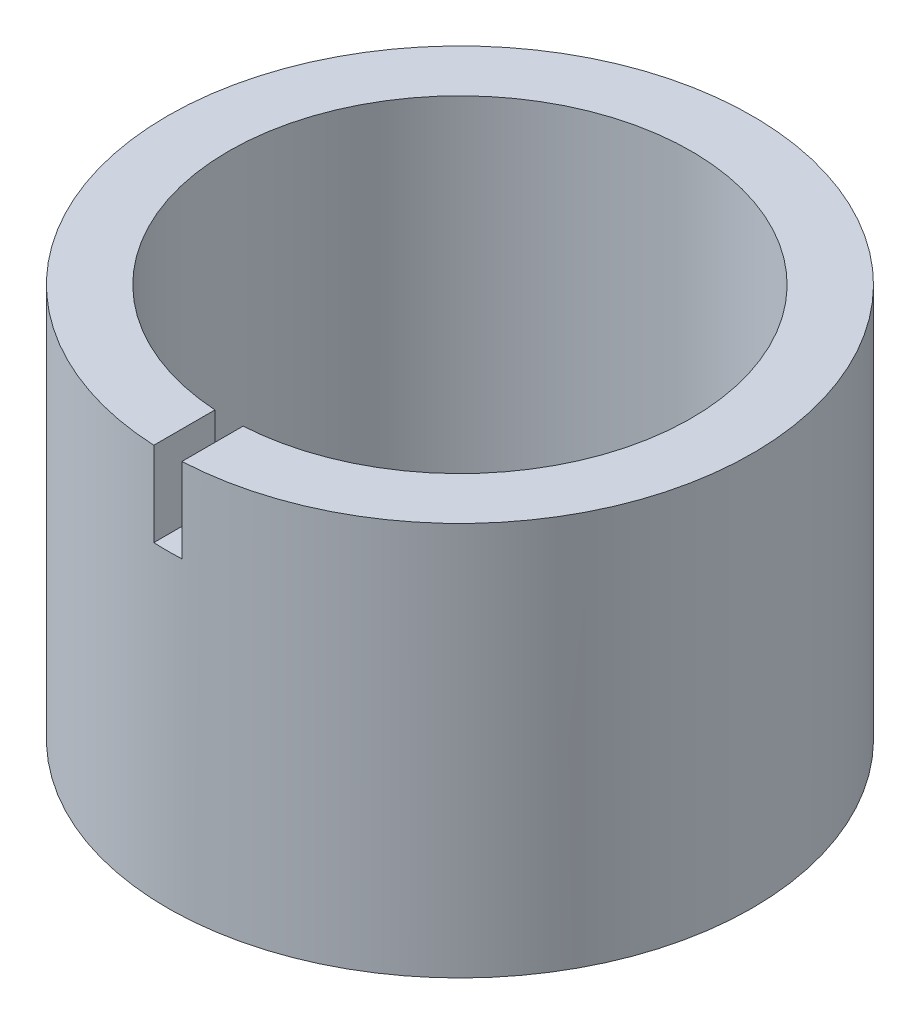
ISO-10303-21;
HEADER;
FILE_DESCRIPTION(('STEP AP214'),'2;1');
FILE_NAME('part.step','',(''),(''),'','','');
FILE_SCHEMA(('AUTOMOTIVE_DESIGN { 1 0 10303 214 1 1 1 1 }'));
ENDSEC;
DATA;
#1=APPLICATION_CONTEXT('core data for automotive mechanical design processes');
#2=APPLICATION_PROTOCOL_DEFINITION('international standard','automotive_design',2000,#1);
#3=PRODUCT_CONTEXT('',#1,'mechanical');
#4=PRODUCT('Part','Part','',(#3));
#5=PRODUCT_RELATED_PRODUCT_CATEGORY('part','',(#4));
#6=PRODUCT_DEFINITION_FORMATION('','',#4);
#7=PRODUCT_DEFINITION_CONTEXT('part definition',#1,'design');
#8=PRODUCT_DEFINITION('design','',#6,#7);
#9=PRODUCT_DEFINITION_SHAPE('','',#8);
#10=(LENGTH_UNIT() NAMED_UNIT(*) SI_UNIT(.MILLI.,.METRE.));
#11=(NAMED_UNIT(*) PLANE_ANGLE_UNIT() SI_UNIT($,.RADIAN.));
#12=(NAMED_UNIT(*) SI_UNIT($,.STERADIAN.) SOLID_ANGLE_UNIT());
#13=UNCERTAINTY_MEASURE_WITH_UNIT(LENGTH_MEASURE(1.E-05),#10,'distance_accuracy_value','');
#14=(GEOMETRIC_REPRESENTATION_CONTEXT(3) GLOBAL_UNCERTAINTY_ASSIGNED_CONTEXT((#13)) GLOBAL_UNIT_ASSIGNED_CONTEXT((#10,
#11,#12)) REPRESENTATION_CONTEXT('',''));
#15=CARTESIAN_POINT('',(0.,0.,0.));
#16=DIRECTION('',(0.,0.,1.));
#17=DIRECTION('',(1.,0.,0.));
#18=AXIS2_PLACEMENT_3D('',#15,#16,#17);
#19=CARTESIAN_POINT('',(0.,17.78,0.));
#20=DIRECTION('',(0.,1.,0.));
#21=DIRECTION('',(0.,0.,1.));
#22=AXIS2_PLACEMENT_3D('',#19,#20,#21);
#23=PLANE('',#22);
#24=DIRECTION('',(0.,0.,-1.));
#25=VECTOR('',#24,1.);
#26=CARTESIAN_POINT('',(0.635000000000008,17.78,13.6448334995251));
#27=LINE('',#26,#25);
#28=CARTESIAN_POINT('',(0.635000000000008,17.78,13.1927267462038));
#29=VERTEX_POINT('',#28);
#30=CARTESIAN_POINT('',(0.635000000000008,17.78,10.4306890951653));
#31=VERTEX_POINT('',#30);
#32=EDGE_CURVE('E108',#29,#31,#27,.T.);
#33=ORIENTED_EDGE('',*,*,#32,.F.);
#34=CARTESIAN_POINT('',(0.,17.78,0.));
#35=DIRECTION('',(0.,1.,0.));
#36=DIRECTION('',(0.,0.,1.));
#37=AXIS2_PLACEMENT_3D('',#34,#35,#36);
#38=CIRCLE('',#37,13.208);
#39=CARTESIAN_POINT('',(-0.634999999999992,17.78,13.1927267462038));
#40=VERTEX_POINT('',#39);
#41=EDGE_CURVE('E123',#29,#40,#38,.T.);
#42=ORIENTED_EDGE('',*,*,#41,.T.);
#43=DIRECTION('',(0.,0.,1.));
#44=VECTOR('',#43,1.);
#45=CARTESIAN_POINT('',(-0.634999999999992,17.78,13.6448334995251));
#46=LINE('',#45,#44);
#47=CARTESIAN_POINT('',(-0.634999999999992,17.78,10.4306890951653));
#48=VERTEX_POINT('',#47);
#49=EDGE_CURVE('E161',#48,#40,#46,.T.);
#50=ORIENTED_EDGE('',*,*,#49,.F.);
#51=CARTESIAN_POINT('',(0.,17.78,0.));
#52=DIRECTION('',(0.,1.,0.));
#53=DIRECTION('',(0.,0.,1.));
#54=AXIS2_PLACEMENT_3D('',#51,#52,#53);
#55=CIRCLE('',#54,10.45);
#56=EDGE_CURVE('E124',#31,#48,#55,.T.);
#57=ORIENTED_EDGE('',*,*,#56,.F.);
#58=EDGE_LOOP('',(#33,#42,#50,#57));
#59=FACE_BOUND('',#58,.T.);
#60=ADVANCED_FACE('F37',(#59),#23,.T.);
#61=CARTESIAN_POINT('',(0.,0.,0.));
#62=DIRECTION('',(0.,1.,0.));
#63=DIRECTION('',(0.,0.,1.));
#64=AXIS2_PLACEMENT_3D('',#61,#62,#63);
#65=PLANE('',#64);
#66=CARTESIAN_POINT('',(0.,0.,0.));
#67=DIRECTION('',(0.,1.,0.));
#68=DIRECTION('',(0.,0.,1.));
#69=AXIS2_PLACEMENT_3D('',#66,#67,#68);
#70=CIRCLE('',#69,10.45);
#71=CARTESIAN_POINT('',(-0.634999999999996,0.,-10.4306890951653));
#72=VERTEX_POINT('',#71);
#73=CARTESIAN_POINT('',(1.171448,0.,-10.3841325869471));
#74=VERTEX_POINT('',#73);
#75=EDGE_CURVE('E118',#72,#74,#70,.T.);
#76=ORIENTED_EDGE('',*,*,#75,.T.);
#77=DIRECTION('',(0.,0.,1.));
#78=VECTOR('',#77,1.);
#79=CARTESIAN_POINT('',(1.171448,0.,-14.4980677579016));
#80=LINE('',#79,#78);
#81=CARTESIAN_POINT('',(1.171448,0.,-13.1559482206071));
#82=VERTEX_POINT('',#81);
#83=EDGE_CURVE('E103',#82,#74,#80,.T.);
#84=ORIENTED_EDGE('',*,*,#83,.F.);
#85=CARTESIAN_POINT('',(0.,0.,0.));
#86=DIRECTION('',(0.,1.,0.));
#87=DIRECTION('',(0.,0.,1.));
#88=AXIS2_PLACEMENT_3D('',#85,#86,#87);
#89=CIRCLE('',#88,13.208);
#90=CARTESIAN_POINT('',(-0.634999999999996,0.,-13.1927267462038));
#91=VERTEX_POINT('',#90);
#92=EDGE_CURVE('E116',#91,#82,#89,.T.);
#93=ORIENTED_EDGE('',*,*,#92,.F.);
#94=DIRECTION('',(0.,0.,-1.));
#95=VECTOR('',#94,1.);
#96=CARTESIAN_POINT('',(-0.634999999999996,0.,-14.4980677579016));
#97=LINE('',#96,#95);
#98=EDGE_CURVE('E119',#72,#91,#97,.T.);
#99=ORIENTED_EDGE('',*,*,#98,.F.);
#100=EDGE_LOOP('',(#76,#84,#93,#99));
#101=FACE_BOUND('',#100,.T.);
#102=ADVANCED_FACE('F114',(#101),#65,.F.);
#103=CARTESIAN_POINT('',(0.,17.78,0.));
#104=DIRECTION('',(0.,-1.,0.));
#105=DIRECTION('',(0.,0.,-1.));
#106=AXIS2_PLACEMENT_3D('',#103,#104,#105);
#107=CYLINDRICAL_SURFACE('',#106,13.208);
#108=ORIENTED_EDGE('',*,*,#92,.T.);
#109=DIRECTION('',(0.,-1.,0.));
#110=VECTOR('',#109,1.);
#111=CARTESIAN_POINT('',(1.171448,17.78,-13.1559482206071));
#112=LINE('',#111,#110);
#113=CARTESIAN_POINT('',(1.171448,3.81,-13.1559482206071));
#114=VERTEX_POINT('',#113);
#115=EDGE_CURVE('E100',#82,#114,#112,.F.);
#116=ORIENTED_EDGE('',*,*,#115,.T.);
#117=CARTESIAN_POINT('',(0.,3.81,0.));
#118=DIRECTION('',(0.,1.,0.));
#119=DIRECTION('',(0.,0.,1.));
#120=AXIS2_PLACEMENT_3D('',#117,#118,#119);
#121=CIRCLE('',#120,13.208);
#122=CARTESIAN_POINT('',(-0.634999999999996,3.81,-13.1927267462038));
#123=VERTEX_POINT('',#122);
#124=EDGE_CURVE('E168',#114,#123,#121,.T.);
#125=ORIENTED_EDGE('',*,*,#124,.T.);
#126=DIRECTION('',(0.,-1.,0.));
#127=VECTOR('',#126,1.);
#128=CARTESIAN_POINT('',(-0.634999999999996,17.78,-13.1927267462038));
#129=LINE('',#128,#127);
#130=EDGE_CURVE('E109',#123,#91,#129,.T.);
#131=ORIENTED_EDGE('',*,*,#130,.T.);
#132=EDGE_LOOP('',(#108,#116,#125,#131));
#133=FACE_BOUND('',#132,.T.);
#134=ORIENTED_EDGE('',*,*,#41,.F.);
#135=DIRECTION('',(0.,-1.,0.));
#136=VECTOR('',#135,1.);
#137=CARTESIAN_POINT('',(0.635000000000008,17.78,13.1927267462038));
#138=LINE('',#137,#136);
#139=CARTESIAN_POINT('',(0.635000000000008,13.97,13.1927267462038));
#140=VERTEX_POINT('',#139);
#141=EDGE_CURVE('E150',#29,#140,#138,.T.);
#142=ORIENTED_EDGE('',*,*,#141,.T.);
#143=CARTESIAN_POINT('',(0.,13.97,0.));
#144=DIRECTION('',(0.,-1.,0.));
#145=DIRECTION('',(0.,0.,-1.));
#146=AXIS2_PLACEMENT_3D('',#143,#144,#145);
#147=CIRCLE('',#146,13.208);
#148=CARTESIAN_POINT('',(-0.634999999999992,13.97,13.1927267462038));
#149=VERTEX_POINT('',#148);
#150=EDGE_CURVE('E157',#140,#149,#147,.T.);
#151=ORIENTED_EDGE('',*,*,#150,.T.);
#152=DIRECTION('',(0.,-1.,0.));
#153=VECTOR('',#152,1.);
#154=CARTESIAN_POINT('',(-0.634999999999992,17.78,13.1927267462038));
#155=LINE('',#154,#153);
#156=EDGE_CURVE('E152',#149,#40,#155,.F.);
#157=ORIENTED_EDGE('',*,*,#156,.T.);
#158=EDGE_LOOP('',(#134,#142,#151,#157));
#159=FACE_BOUND('',#158,.T.);
#160=ADVANCED_FACE('F39',(#133,#159),#107,.T.);
#161=CARTESIAN_POINT('',(0.,17.78,0.));
#162=DIRECTION('',(0.,-1.,0.));
#163=DIRECTION('',(0.,0.,-1.));
#164=AXIS2_PLACEMENT_3D('',#161,#162,#163);
#165=CYLINDRICAL_SURFACE('',#164,10.45);
#166=DIRECTION('',(0.,-1.,0.));
#167=VECTOR('',#166,1.);
#168=CARTESIAN_POINT('',(1.171448,17.78,-10.3841325869471));
#169=LINE('',#168,#167);
#170=CARTESIAN_POINT('',(1.171448,3.81,-10.3841325869471));
#171=VERTEX_POINT('',#170);
#172=EDGE_CURVE('E11',#74,#171,#169,.F.);
#173=ORIENTED_EDGE('',*,*,#172,.F.);
#174=ORIENTED_EDGE('',*,*,#75,.F.);
#175=DIRECTION('',(0.,-1.,0.));
#176=VECTOR('',#175,1.);
#177=CARTESIAN_POINT('',(-0.634999999999996,17.78,-10.4306890951653));
#178=LINE('',#177,#176);
#179=CARTESIAN_POINT('',(-0.634999999999996,3.81,-10.4306890951653));
#180=VERTEX_POINT('',#179);
#181=EDGE_CURVE('E45',#180,#72,#178,.T.);
#182=ORIENTED_EDGE('',*,*,#181,.F.);
#183=CARTESIAN_POINT('',(0.,3.81,0.));
#184=DIRECTION('',(0.,1.,0.));
#185=DIRECTION('',(0.,0.,1.));
#186=AXIS2_PLACEMENT_3D('',#183,#184,#185);
#187=CIRCLE('',#186,10.45);
#188=EDGE_CURVE('E138',#171,#180,#187,.T.);
#189=ORIENTED_EDGE('',*,*,#188,.F.);
#190=EDGE_LOOP('',(#173,#174,#182,#189));
#191=FACE_BOUND('',#190,.T.);
#192=DIRECTION('',(0.,-1.,0.));
#193=VECTOR('',#192,1.);
#194=CARTESIAN_POINT('',(0.635000000000007,17.78,10.4306890951653));
#195=LINE('',#194,#193);
#196=CARTESIAN_POINT('',(0.635000000000008,13.97,10.4306890951653));
#197=VERTEX_POINT('',#196);
#198=EDGE_CURVE('E136',#31,#197,#195,.T.);
#199=ORIENTED_EDGE('',*,*,#198,.F.);
#200=ORIENTED_EDGE('',*,*,#56,.T.);
#201=DIRECTION('',(0.,-1.,0.));
#202=VECTOR('',#201,1.);
#203=CARTESIAN_POINT('',(-0.634999999999992,17.78,10.4306890951653));
#204=LINE('',#203,#202);
#205=CARTESIAN_POINT('',(-0.634999999999992,13.97,10.4306890951653));
#206=VERTEX_POINT('',#205);
#207=EDGE_CURVE('E134',#206,#48,#204,.F.);
#208=ORIENTED_EDGE('',*,*,#207,.F.);
#209=CARTESIAN_POINT('',(0.,13.97,0.));
#210=DIRECTION('',(0.,-1.,0.));
#211=DIRECTION('',(0.,0.,-1.));
#212=AXIS2_PLACEMENT_3D('',#209,#210,#211);
#213=CIRCLE('',#212,10.45);
#214=EDGE_CURVE('E127',#197,#206,#213,.T.);
#215=ORIENTED_EDGE('',*,*,#214,.F.);
#216=EDGE_LOOP('',(#199,#200,#208,#215));
#217=FACE_BOUND('',#216,.T.);
#218=ADVANCED_FACE('F148',(#191,#217),#165,.F.);
#219=CARTESIAN_POINT('',(0.635000000000008,13.97,13.6448334995251));
#220=DIRECTION('',(1.,0.,0.));
#221=DIRECTION('',(0.,0.,-1.));
#222=AXIS2_PLACEMENT_3D('',#219,#220,#221);
#223=PLANE('',#222);
#224=ORIENTED_EDGE('',*,*,#32,.T.);
#225=ORIENTED_EDGE('',*,*,#198,.T.);
#226=DIRECTION('',(0.,0.,-1.));
#227=VECTOR('',#226,1.);
#228=CARTESIAN_POINT('',(0.635000000000008,13.97,13.6448334995251));
#229=LINE('',#228,#227);
#230=EDGE_CURVE('E59',#140,#197,#229,.T.);
#231=ORIENTED_EDGE('',*,*,#230,.F.);
#232=ORIENTED_EDGE('',*,*,#141,.F.);
#233=EDGE_LOOP('',(#224,#225,#231,#232));
#234=FACE_BOUND('',#233,.T.);
#235=ADVANCED_FACE('F188',(#234),#223,.F.);
#236=CARTESIAN_POINT('',(-0.634999999999992,13.97,13.6448334995251));
#237=DIRECTION('',(-1.,0.,0.));
#238=DIRECTION('',(0.,0.,1.));
#239=AXIS2_PLACEMENT_3D('',#236,#237,#238);
#240=PLANE('',#239);
#241=DIRECTION('',(0.,0.,1.));
#242=VECTOR('',#241,1.);
#243=CARTESIAN_POINT('',(-0.634999999999992,13.97,13.6448334995251));
#244=LINE('',#243,#242);
#245=EDGE_CURVE('E160',#206,#149,#244,.T.);
#246=ORIENTED_EDGE('',*,*,#245,.F.);
#247=ORIENTED_EDGE('',*,*,#207,.T.);
#248=ORIENTED_EDGE('',*,*,#49,.T.);
#249=ORIENTED_EDGE('',*,*,#156,.F.);
#250=EDGE_LOOP('',(#246,#247,#248,#249));
#251=FACE_BOUND('',#250,.T.);
#252=ADVANCED_FACE('F191',(#251),#240,.F.);
#253=CARTESIAN_POINT('',(0.,13.97,0.));
#254=DIRECTION('',(0.,-1.,0.));
#255=DIRECTION('',(0.,0.,-1.));
#256=AXIS2_PLACEMENT_3D('',#253,#254,#255);
#257=PLANE('',#256);
#258=ORIENTED_EDGE('',*,*,#230,.T.);
#259=ORIENTED_EDGE('',*,*,#214,.T.);
#260=ORIENTED_EDGE('',*,*,#245,.T.);
#261=ORIENTED_EDGE('',*,*,#150,.F.);
#262=EDGE_LOOP('',(#258,#259,#260,#261));
#263=FACE_BOUND('',#262,.T.);
#264=ADVANCED_FACE('F195',(#263),#257,.F.);
#265=CARTESIAN_POINT('',(1.171448,3.81,-14.4980677579016));
#266=DIRECTION('',(1.,0.,0.));
#267=DIRECTION('',(0.,0.,-1.));
#268=AXIS2_PLACEMENT_3D('',#265,#266,#267);
#269=PLANE('',#268);
#270=ORIENTED_EDGE('',*,*,#83,.T.);
#271=ORIENTED_EDGE('',*,*,#172,.T.);
#272=DIRECTION('',(0.,0.,1.));
#273=VECTOR('',#272,1.);
#274=CARTESIAN_POINT('',(1.171448,3.81,-14.4980677579016));
#275=LINE('',#274,#273);
#276=EDGE_CURVE('E52',#114,#171,#275,.T.);
#277=ORIENTED_EDGE('',*,*,#276,.F.);
#278=ORIENTED_EDGE('',*,*,#115,.F.);
#279=EDGE_LOOP('',(#270,#271,#277,#278));
#280=FACE_BOUND('',#279,.T.);
#281=ADVANCED_FACE('F102',(#280),#269,.F.);
#282=CARTESIAN_POINT('',(-0.634999999999996,3.81,-14.4980677579016));
#283=DIRECTION('',(-1.,0.,0.));
#284=DIRECTION('',(0.,0.,1.));
#285=AXIS2_PLACEMENT_3D('',#282,#283,#284);
#286=PLANE('',#285);
#287=DIRECTION('',(0.,0.,-1.));
#288=VECTOR('',#287,1.);
#289=CARTESIAN_POINT('',(-0.634999999999996,3.81,-14.4980677579016));
#290=LINE('',#289,#288);
#291=EDGE_CURVE('E144',#180,#123,#290,.T.);
#292=ORIENTED_EDGE('',*,*,#291,.F.);
#293=ORIENTED_EDGE('',*,*,#181,.T.);
#294=ORIENTED_EDGE('',*,*,#98,.T.);
#295=ORIENTED_EDGE('',*,*,#130,.F.);
#296=EDGE_LOOP('',(#292,#293,#294,#295));
#297=FACE_BOUND('',#296,.T.);
#298=ADVANCED_FACE('F142',(#297),#286,.F.);
#299=CARTESIAN_POINT('',(0.,3.81,0.));
#300=DIRECTION('',(0.,1.,0.));
#301=DIRECTION('',(0.,0.,1.));
#302=AXIS2_PLACEMENT_3D('',#299,#300,#301);
#303=PLANE('',#302);
#304=ORIENTED_EDGE('',*,*,#276,.T.);
#305=ORIENTED_EDGE('',*,*,#188,.T.);
#306=ORIENTED_EDGE('',*,*,#291,.T.);
#307=ORIENTED_EDGE('',*,*,#124,.F.);
#308=EDGE_LOOP('',(#304,#305,#306,#307));
#309=FACE_BOUND('',#308,.T.);
#310=ADVANCED_FACE('F171',(#309),#303,.F.);
#311=CLOSED_SHELL('',(#60,#102,#160,#218,#235,#252,#264,#281,#298,#310));
#312=MANIFOLD_SOLID_BREP('B2',#311);
#313=ADVANCED_BREP_SHAPE_REPRESENTATION('',(#18,#312),#14);
#314=SHAPE_DEFINITION_REPRESENTATION(#9,#313);
ENDSEC;
END-ISO-10303-21;
